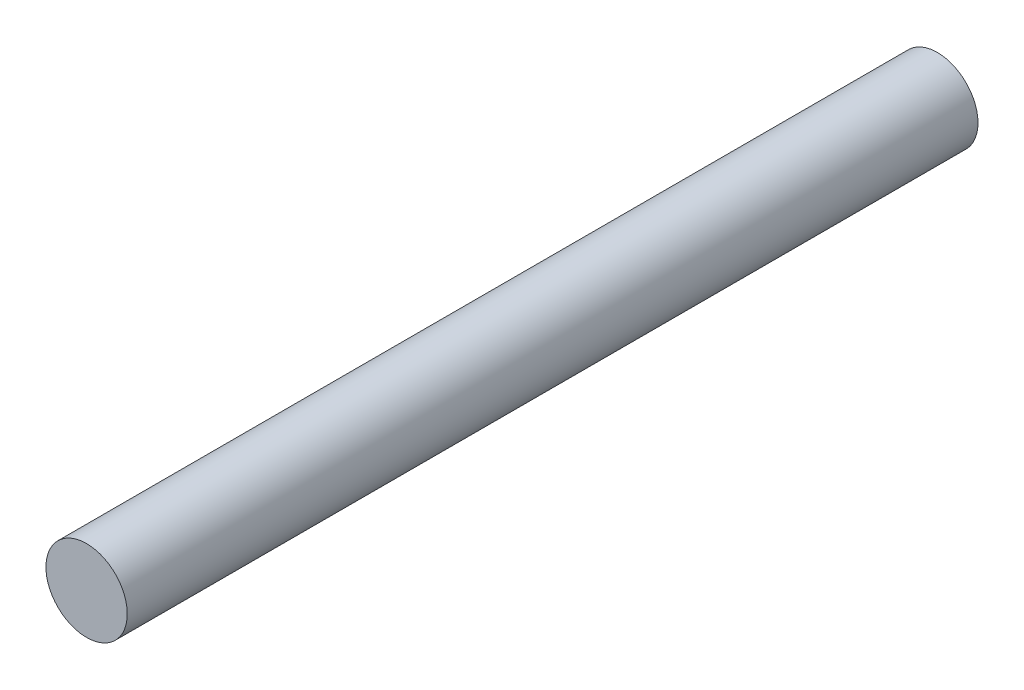
ISO-10303-21;
HEADER;
FILE_DESCRIPTION(('STEP AP214'),'2;1');
FILE_NAME('part.step','',(''),(''),'','','');
FILE_SCHEMA(('AUTOMOTIVE_DESIGN { 1 0 10303 214 1 1 1 1 }'));
ENDSEC;
DATA;
#1=APPLICATION_CONTEXT('core data for automotive mechanical design processes');
#2=APPLICATION_PROTOCOL_DEFINITION('international standard','automotive_design',2000,#1);
#3=PRODUCT_CONTEXT('',#1,'mechanical');
#4=PRODUCT('Part','Part','',(#3));
#5=PRODUCT_RELATED_PRODUCT_CATEGORY('part','',(#4));
#6=PRODUCT_DEFINITION_FORMATION('','',#4);
#7=PRODUCT_DEFINITION_CONTEXT('part definition',#1,'design');
#8=PRODUCT_DEFINITION('design','',#6,#7);
#9=PRODUCT_DEFINITION_SHAPE('','',#8);
#10=(LENGTH_UNIT() NAMED_UNIT(*) SI_UNIT(.MILLI.,.METRE.));
#11=(NAMED_UNIT(*) PLANE_ANGLE_UNIT() SI_UNIT($,.RADIAN.));
#12=(NAMED_UNIT(*) SI_UNIT($,.STERADIAN.) SOLID_ANGLE_UNIT());
#13=UNCERTAINTY_MEASURE_WITH_UNIT(LENGTH_MEASURE(1.E-05),#10,'distance_accuracy_value','');
#14=(GEOMETRIC_REPRESENTATION_CONTEXT(3) GLOBAL_UNCERTAINTY_ASSIGNED_CONTEXT((#13)) GLOBAL_UNIT_ASSIGNED_CONTEXT((#10,
#11,#12)) REPRESENTATION_CONTEXT('',''));
#15=CARTESIAN_POINT('',(0.,0.,0.));
#16=DIRECTION('',(0.,0.,1.));
#17=DIRECTION('',(1.,0.,0.));
#18=AXIS2_PLACEMENT_3D('',#15,#16,#17);
#19=CARTESIAN_POINT('',(0.,0.,52.3));
#20=DIRECTION('',(0.,0.,-1.));
#21=DIRECTION('',(-1.,0.,0.));
#22=AXIS2_PLACEMENT_3D('',#19,#20,#21);
#23=CYLINDRICAL_SURFACE('',#22,2.5);
#24=CARTESIAN_POINT('',(0.,0.,52.3));
#25=DIRECTION('',(0.,0.,1.));
#26=DIRECTION('',(1.,0.,0.));
#27=AXIS2_PLACEMENT_3D('',#24,#25,#26);
#28=CIRCLE('',#27,2.5);
#29=CARTESIAN_POINT('',(2.5,0.,52.3));
#30=VERTEX_POINT('',#29);
#31=EDGE_CURVE('E10',#30,#30,#28,.T.);
#32=ORIENTED_EDGE('',*,*,#31,.F.);
#33=EDGE_LOOP('',(#32));
#34=FACE_BOUND('',#33,.T.);
#35=CARTESIAN_POINT('',(0.,0.,0.));
#36=DIRECTION('',(0.,0.,1.));
#37=DIRECTION('',(1.,0.,0.));
#38=AXIS2_PLACEMENT_3D('',#35,#36,#37);
#39=CIRCLE('',#38,2.5);
#40=CARTESIAN_POINT('',(2.5,0.,0.));
#41=VERTEX_POINT('',#40);
#42=EDGE_CURVE('E38',#41,#41,#39,.T.);
#43=ORIENTED_EDGE('',*,*,#42,.T.);
#44=EDGE_LOOP('',(#43));
#45=FACE_BOUND('',#44,.T.);
#46=ADVANCED_FACE('F35',(#34,#45),#23,.T.);
#47=CARTESIAN_POINT('',(0.,0.,52.3));
#48=DIRECTION('',(0.,0.,1.));
#49=DIRECTION('',(1.,0.,0.));
#50=AXIS2_PLACEMENT_3D('',#47,#48,#49);
#51=PLANE('',#50);
#52=ORIENTED_EDGE('',*,*,#31,.T.);
#53=EDGE_LOOP('',(#52));
#54=FACE_BOUND('',#53,.T.);
#55=ADVANCED_FACE('F50',(#54),#51,.T.);
#56=CARTESIAN_POINT('',(0.,0.,0.));
#57=DIRECTION('',(0.,0.,1.));
#58=DIRECTION('',(1.,0.,0.));
#59=AXIS2_PLACEMENT_3D('',#56,#57,#58);
#60=PLANE('',#59);
#61=ORIENTED_EDGE('',*,*,#42,.F.);
#62=EDGE_LOOP('',(#61));
#63=FACE_BOUND('',#62,.T.);
#64=ADVANCED_FACE('F48',(#63),#60,.F.);
#65=CLOSED_SHELL('',(#46,#55,#64));
#66=MANIFOLD_SOLID_BREP('B2',#65);
#67=ADVANCED_BREP_SHAPE_REPRESENTATION('',(#18,#66),#14);
#68=SHAPE_DEFINITION_REPRESENTATION(#9,#67);
ENDSEC;
END-ISO-10303-21;
